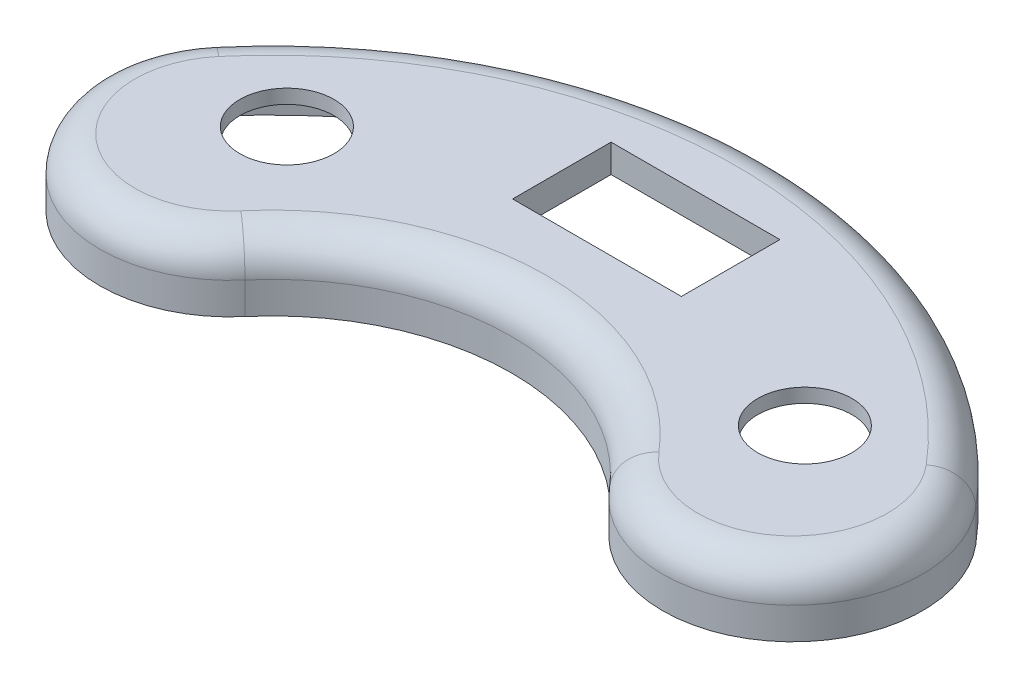
ISO-10303-21;
HEADER;
FILE_DESCRIPTION(('STEP AP214'),'2;1');
FILE_NAME('part.step','',(''),(''),'','','');
FILE_SCHEMA(('AUTOMOTIVE_DESIGN { 1 0 10303 214 1 1 1 1 }'));
ENDSEC;
DATA;
#1=APPLICATION_CONTEXT('core data for automotive mechanical design processes');
#2=APPLICATION_PROTOCOL_DEFINITION('international standard','automotive_design',2000,#1);
#3=PRODUCT_CONTEXT('',#1,'mechanical');
#4=PRODUCT('Part','Part','',(#3));
#5=PRODUCT_RELATED_PRODUCT_CATEGORY('part','',(#4));
#6=PRODUCT_DEFINITION_FORMATION('','',#4);
#7=PRODUCT_DEFINITION_CONTEXT('part definition',#1,'design');
#8=PRODUCT_DEFINITION('design','',#6,#7);
#9=PRODUCT_DEFINITION_SHAPE('','',#8);
#10=(LENGTH_UNIT() NAMED_UNIT(*) SI_UNIT(.MILLI.,.METRE.));
#11=(NAMED_UNIT(*) PLANE_ANGLE_UNIT() SI_UNIT($,.RADIAN.));
#12=(NAMED_UNIT(*) SI_UNIT($,.STERADIAN.) SOLID_ANGLE_UNIT());
#13=UNCERTAINTY_MEASURE_WITH_UNIT(LENGTH_MEASURE(1.E-05),#10,'distance_accuracy_value','');
#14=(GEOMETRIC_REPRESENTATION_CONTEXT(3) GLOBAL_UNCERTAINTY_ASSIGNED_CONTEXT((#13)) GLOBAL_UNIT_ASSIGNED_CONTEXT((#10,
#11,#12)) REPRESENTATION_CONTEXT('',''));
#15=CARTESIAN_POINT('',(0.,0.,0.));
#16=DIRECTION('',(0.,0.,1.));
#17=DIRECTION('',(1.,0.,0.));
#18=AXIS2_PLACEMENT_3D('',#15,#16,#17);
#19=CARTESIAN_POINT('',(32.5063719659927,21.59,21.5139508650748));
#20=DIRECTION('',(0.,1.,0.));
#21=DIRECTION('',(0.,0.,1.));
#22=AXIS2_PLACEMENT_3D('',#19,#20,#21);
#23=PLANE('',#22);
#24=CARTESIAN_POINT('',(53.8552329844878,21.59,-6.26058606286144));
#25=DIRECTION('',(0.,1.,0.));
#26=DIRECTION('',(0.,0.,1.));
#27=AXIS2_PLACEMENT_3D('',#24,#25,#26);
#28=CIRCLE('',#27,8.50000000000001);
#29=CARTESIAN_POINT('',(53.8552329844878,21.59,2.23941393713857));
#30=VERTEX_POINT('',#29);
#31=EDGE_CURVE('E211',#30,#30,#28,.T.);
#32=ORIENTED_EDGE('',*,*,#31,.F.);
#33=EDGE_LOOP('',(#32));
#34=FACE_BOUND('',#33,.T.);
#35=CARTESIAN_POINT('',(-39.6424890525023,21.59,-6.26058606286144));
#36=DIRECTION('',(0.,1.,0.));
#37=DIRECTION('',(0.,0.,1.));
#38=AXIS2_PLACEMENT_3D('',#35,#36,#37);
#39=CIRCLE('',#38,8.5);
#40=CARTESIAN_POINT('',(-39.6424890525023,21.59,2.23941393713856));
#41=VERTEX_POINT('',#40);
#42=EDGE_CURVE('E215',#41,#41,#39,.T.);
#43=ORIENTED_EDGE('',*,*,#42,.F.);
#44=EDGE_LOOP('',(#43));
#45=FACE_BOUND('',#44,.T.);
#46=CARTESIAN_POINT('',(-43.6936280340073,21.59,0.));
#47=DIRECTION('',(0.,1.,0.));
#48=DIRECTION('',(0.,0.,1.));
#49=AXIS2_PLACEMENT_3D('',#46,#47,#48);
#50=CIRCLE('',#49,17.119295081542);
#51=CARTESIAN_POINT('',(-56.7567727604326,21.59,-11.0645611727431));
#52=VERTEX_POINT('',#51);
#53=CARTESIAN_POINT('',(-30.630483307582,21.59,11.0645611727431));
#54=VERTEX_POINT('',#53);
#55=EDGE_CURVE('E286',#52,#54,#50,.T.);
#56=ORIENTED_EDGE('',*,*,#55,.T.);
#57=CARTESIAN_POINT('',(7.10637196599272,21.59,43.0279017301496));
#58=DIRECTION('',(0.,1.,0.));
#59=DIRECTION('',(0.,0.,1.));
#60=AXIS2_PLACEMENT_3D('',#57,#58,#59);
#61=CIRCLE('',#60,49.4542757052155);
#62=CARTESIAN_POINT('',(44.8432272395674,21.59,11.0645611727431));
#63=VERTEX_POINT('',#62);
#64=EDGE_CURVE('E288',#54,#63,#61,.F.);
#65=ORIENTED_EDGE('',*,*,#64,.T.);
#66=CARTESIAN_POINT('',(57.9063719659927,21.59,0.));
#67=DIRECTION('',(0.,1.,0.));
#68=DIRECTION('',(0.,0.,1.));
#69=AXIS2_PLACEMENT_3D('',#66,#67,#68);
#70=CIRCLE('',#69,17.119295081542);
#71=CARTESIAN_POINT('',(70.969516692418,21.59,-11.0645611727431));
#72=VERTEX_POINT('',#71);
#73=EDGE_CURVE('E293',#63,#72,#70,.T.);
#74=ORIENTED_EDGE('',*,*,#73,.T.);
#75=CARTESIAN_POINT('',(7.10637196599272,21.59,43.0279017301496));
#76=DIRECTION('',(0.,1.,0.));
#77=DIRECTION('',(0.,0.,1.));
#78=AXIS2_PLACEMENT_3D('',#75,#76,#77);
#79=CIRCLE('',#78,83.6928658682994);
#80=EDGE_CURVE('E289',#72,#52,#79,.T.);
#81=ORIENTED_EDGE('',*,*,#80,.T.);
#82=EDGE_LOOP('',(#56,#65,#74,#81));
#83=FACE_BOUND('',#82,.T.);
#84=DIRECTION('',(0.,0.,1.));
#85=VECTOR('',#84,1.);
#86=CARTESIAN_POINT('',(-7.95035958705516,21.59,21.5139508650748));
#87=LINE('',#86,#85);
#88=CARTESIAN_POINT('',(-7.95035958705517,21.59,-33.0865472509014));
#89=VERTEX_POINT('',#88);
#90=CARTESIAN_POINT('',(-7.95035958705517,21.59,-15.3065472509014));
#91=VERTEX_POINT('',#90);
#92=EDGE_CURVE('E297',#89,#91,#87,.T.);
#93=ORIENTED_EDGE('',*,*,#92,.F.);
#94=DIRECTION('',(1.,0.,0.));
#95=VECTOR('',#94,1.);
#96=CARTESIAN_POINT('',(32.5063719659927,21.59,-33.0865472509014));
#97=LINE('',#96,#95);
#98=CARTESIAN_POINT('',(22.5296404129448,21.59,-33.0865472509014));
#99=VERTEX_POINT('',#98);
#100=EDGE_CURVE('E277',#89,#99,#97,.T.);
#101=ORIENTED_EDGE('',*,*,#100,.T.);
#102=DIRECTION('',(0.,0.,1.));
#103=VECTOR('',#102,1.);
#104=CARTESIAN_POINT('',(22.5296404129448,21.59,21.5139508650748));
#105=LINE('',#104,#103);
#106=CARTESIAN_POINT('',(22.5296404129448,21.59,-15.3065472509014));
#107=VERTEX_POINT('',#106);
#108=EDGE_CURVE('E304',#99,#107,#105,.T.);
#109=ORIENTED_EDGE('',*,*,#108,.T.);
#110=DIRECTION('',(1.,0.,0.));
#111=VECTOR('',#110,1.);
#112=CARTESIAN_POINT('',(32.5063719659927,21.59,-15.3065472509014));
#113=LINE('',#112,#111);
#114=EDGE_CURVE('E301',#91,#107,#113,.T.);
#115=ORIENTED_EDGE('',*,*,#114,.F.);
#116=EDGE_LOOP('',(#93,#101,#109,#115));
#117=FACE_BOUND('',#116,.T.);
#118=ADVANCED_FACE('F36',(#34,#45,#83,#117),#23,.T.);
#119=CARTESIAN_POINT('',(57.9063719659927,19.05,0.));
#120=DIRECTION('',(0.,-1.,0.));
#121=DIRECTION('',(0.,0.,-1.));
#122=AXIS2_PLACEMENT_3D('',#119,#120,#121);
#123=CYLINDRICAL_SURFACE('',#122,23.469295081542);
#124=DIRECTION('',(0.,-1.,0.));
#125=VECTOR('',#124,1.);
#126=CARTESIAN_POINT('',(39.9977608452041,19.05,15.168699988755));
#127=LINE('',#126,#125);
#128=CARTESIAN_POINT('',(39.9977608452041,15.24,15.168699988755));
#129=VERTEX_POINT('',#128);
#130=CARTESIAN_POINT('',(39.9977608452041,9.525,15.168699988755));
#131=VERTEX_POINT('',#130);
#132=EDGE_CURVE('E319',#129,#131,#127,.T.);
#133=ORIENTED_EDGE('',*,*,#132,.T.);
#134=CARTESIAN_POINT('',(57.9063719659927,9.525,0.));
#135=DIRECTION('',(0.,1.,0.));
#136=DIRECTION('',(0.,0.,1.));
#137=AXIS2_PLACEMENT_3D('',#134,#135,#136);
#138=CIRCLE('',#137,23.469295081542);
#139=CARTESIAN_POINT('',(75.8149830867813,9.525,-15.168699988755));
#140=VERTEX_POINT('',#139);
#141=EDGE_CURVE('E51',#131,#140,#138,.T.);
#142=ORIENTED_EDGE('',*,*,#141,.T.);
#143=DIRECTION('',(0.,-1.,0.));
#144=VECTOR('',#143,1.);
#145=CARTESIAN_POINT('',(75.8149830867813,19.05,-15.168699988755));
#146=LINE('',#145,#144);
#147=CARTESIAN_POINT('',(75.8149830867813,15.24,-15.168699988755));
#148=VERTEX_POINT('',#147);
#149=EDGE_CURVE('E295',#148,#140,#146,.T.);
#150=ORIENTED_EDGE('',*,*,#149,.F.);
#151=CARTESIAN_POINT('',(57.9063719659927,15.24,0.));
#152=DIRECTION('',(0.,-1.,0.));
#153=DIRECTION('',(0.,0.,-1.));
#154=AXIS2_PLACEMENT_3D('',#151,#152,#153);
#155=CIRCLE('',#154,23.469295081542);
#156=EDGE_CURVE('E44',#148,#129,#155,.T.);
#157=ORIENTED_EDGE('',*,*,#156,.T.);
#158=EDGE_LOOP('',(#133,#142,#150,#157));
#159=FACE_BOUND('',#158,.T.);
#160=ADVANCED_FACE('F382',(#159),#123,.T.);
#161=CARTESIAN_POINT('',(7.10637196599272,19.05,43.0279017301496));
#162=DIRECTION('',(0.,-1.,0.));
#163=DIRECTION('',(0.,0.,-1.));
#164=AXIS2_PLACEMENT_3D('',#161,#162,#163);
#165=CYLINDRICAL_SURFACE('',#164,90.0428658682994);
#166=ORIENTED_EDGE('',*,*,#149,.T.);
#167=CARTESIAN_POINT('',(7.10637196599272,9.525,43.0279017301496));
#168=DIRECTION('',(0.,1.,0.));
#169=DIRECTION('',(0.,0.,1.));
#170=AXIS2_PLACEMENT_3D('',#167,#168,#169);
#171=CIRCLE('',#170,90.0428658682994);
#172=CARTESIAN_POINT('',(-61.6022391547959,9.525,-15.168699988755));
#173=VERTEX_POINT('',#172);
#174=EDGE_CURVE('E207',#140,#173,#171,.T.);
#175=ORIENTED_EDGE('',*,*,#174,.T.);
#176=DIRECTION('',(0.,-1.,0.));
#177=VECTOR('',#176,1.);
#178=CARTESIAN_POINT('',(-61.6022391547959,19.05,-15.168699988755));
#179=LINE('',#178,#177);
#180=CARTESIAN_POINT('',(-61.6022391547959,15.24,-15.168699988755));
#181=VERTEX_POINT('',#180);
#182=EDGE_CURVE('E325',#181,#173,#179,.T.);
#183=ORIENTED_EDGE('',*,*,#182,.F.);
#184=CARTESIAN_POINT('',(7.10637196599272,15.24,43.0279017301496));
#185=DIRECTION('',(0.,-1.,0.));
#186=DIRECTION('',(0.,0.,-1.));
#187=AXIS2_PLACEMENT_3D('',#184,#185,#186);
#188=CIRCLE('',#187,90.0428658682994);
#189=EDGE_CURVE('E314',#181,#148,#188,.T.);
#190=ORIENTED_EDGE('',*,*,#189,.T.);
#191=EDGE_LOOP('',(#166,#175,#183,#190));
#192=FACE_BOUND('',#191,.T.);
#193=ADVANCED_FACE('F388',(#192),#165,.T.);
#194=CARTESIAN_POINT('',(-43.6936280340073,19.05,0.));
#195=DIRECTION('',(0.,-1.,0.));
#196=DIRECTION('',(0.,0.,-1.));
#197=AXIS2_PLACEMENT_3D('',#194,#195,#196);
#198=CYLINDRICAL_SURFACE('',#197,23.469295081542);
#199=ORIENTED_EDGE('',*,*,#182,.T.);
#200=CARTESIAN_POINT('',(-43.6936280340073,9.525,0.));
#201=DIRECTION('',(0.,1.,0.));
#202=DIRECTION('',(0.,0.,1.));
#203=AXIS2_PLACEMENT_3D('',#200,#201,#202);
#204=CIRCLE('',#203,23.469295081542);
#205=CARTESIAN_POINT('',(-25.7850169132187,9.525,15.168699988755));
#206=VERTEX_POINT('',#205);
#207=EDGE_CURVE('E204',#173,#206,#204,.T.);
#208=ORIENTED_EDGE('',*,*,#207,.T.);
#209=DIRECTION('',(0.,-1.,0.));
#210=VECTOR('',#209,1.);
#211=CARTESIAN_POINT('',(-25.7850169132187,19.05,15.168699988755));
#212=LINE('',#211,#210);
#213=CARTESIAN_POINT('',(-25.7850169132187,15.24,15.168699988755));
#214=VERTEX_POINT('',#213);
#215=EDGE_CURVE('E322',#214,#206,#212,.T.);
#216=ORIENTED_EDGE('',*,*,#215,.F.);
#217=CARTESIAN_POINT('',(-43.6936280340073,15.24,0.));
#218=DIRECTION('',(0.,-1.,0.));
#219=DIRECTION('',(0.,0.,-1.));
#220=AXIS2_PLACEMENT_3D('',#217,#218,#219);
#221=CIRCLE('',#220,23.469295081542);
#222=EDGE_CURVE('E316',#214,#181,#221,.T.);
#223=ORIENTED_EDGE('',*,*,#222,.T.);
#224=EDGE_LOOP('',(#199,#208,#216,#223));
#225=FACE_BOUND('',#224,.T.);
#226=ADVANCED_FACE('F399',(#225),#198,.T.);
#227=CARTESIAN_POINT('',(7.10637196599272,19.05,43.0279017301496));
#228=DIRECTION('',(0.,-1.,0.));
#229=DIRECTION('',(0.,0.,-1.));
#230=AXIS2_PLACEMENT_3D('',#227,#228,#229);
#231=CYLINDRICAL_SURFACE('',#230,43.1042757052155);
#232=ORIENTED_EDGE('',*,*,#215,.T.);
#233=CARTESIAN_POINT('',(7.10637196599272,9.525,43.0279017301496));
#234=DIRECTION('',(0.,1.,0.));
#235=DIRECTION('',(0.,0.,1.));
#236=AXIS2_PLACEMENT_3D('',#233,#234,#235);
#237=CIRCLE('',#236,43.1042757052155);
#238=EDGE_CURVE('E193',#206,#131,#237,.F.);
#239=ORIENTED_EDGE('',*,*,#238,.T.);
#240=ORIENTED_EDGE('',*,*,#132,.F.);
#241=CARTESIAN_POINT('',(7.10637196599272,15.24,43.0279017301496));
#242=DIRECTION('',(0.,-1.,0.));
#243=DIRECTION('',(0.,0.,-1.));
#244=AXIS2_PLACEMENT_3D('',#241,#242,#243);
#245=CIRCLE('',#244,43.1042757052155);
#246=EDGE_CURVE('E292',#129,#214,#245,.F.);
#247=ORIENTED_EDGE('',*,*,#246,.T.);
#248=EDGE_LOOP('',(#232,#239,#240,#247));
#249=FACE_BOUND('',#248,.T.);
#250=ADVANCED_FACE('F403',(#249),#231,.F.);
#251=CARTESIAN_POINT('',(7.10637196599272,15.24,43.0279017301496));
#252=DIRECTION('',(0.,1.,0.));
#253=DIRECTION('',(0.,0.,1.));
#254=AXIS2_PLACEMENT_3D('',#251,#252,#253);
#255=TOROIDAL_SURFACE('',#254,83.6928658682994,6.35);
#256=CARTESIAN_POINT('',(70.969516692418,15.24,-11.0645611727431));
#257=DIRECTION('',(0.646321073387707,0.,0.763065573915481));
#258=DIRECTION('',(0.763065573915481,0.,-0.646321073387707));
#259=AXIS2_PLACEMENT_3D('',#256,#257,#258);
#260=CIRCLE('',#259,6.35);
#261=EDGE_CURVE('E309',#148,#72,#260,.T.);
#262=ORIENTED_EDGE('',*,*,#261,.F.);
#263=ORIENTED_EDGE('',*,*,#189,.F.);
#264=CARTESIAN_POINT('',(-56.7567727604326,15.24,-11.0645611727431));
#265=DIRECTION('',(0.646321073387707,0.,-0.763065573915481));
#266=DIRECTION('',(-0.763065573915481,0.,-0.646321073387707));
#267=AXIS2_PLACEMENT_3D('',#264,#265,#266);
#268=CIRCLE('',#267,6.35);
#269=EDGE_CURVE('E312',#52,#181,#268,.F.);
#270=ORIENTED_EDGE('',*,*,#269,.F.);
#271=ORIENTED_EDGE('',*,*,#80,.F.);
#272=EDGE_LOOP('',(#262,#263,#270,#271));
#273=FACE_BOUND('',#272,.T.);
#274=ADVANCED_FACE('F407',(#273),#255,.T.);
#275=CARTESIAN_POINT('',(-43.6936280340073,15.24,0.));
#276=DIRECTION('',(0.,1.,0.));
#277=DIRECTION('',(0.,0.,1.));
#278=AXIS2_PLACEMENT_3D('',#275,#276,#277);
#279=TOROIDAL_SURFACE('',#278,17.119295081542,6.35);
#280=ORIENTED_EDGE('',*,*,#269,.T.);
#281=ORIENTED_EDGE('',*,*,#222,.F.);
#282=CARTESIAN_POINT('',(-30.630483307582,15.24,11.0645611727431));
#283=DIRECTION('',(0.646321073387707,0.,-0.763065573915481));
#284=DIRECTION('',(-0.763065573915481,0.,-0.646321073387707));
#285=AXIS2_PLACEMENT_3D('',#282,#283,#284);
#286=CIRCLE('',#285,6.35);
#287=EDGE_CURVE('E313',#54,#214,#286,.T.);
#288=ORIENTED_EDGE('',*,*,#287,.F.);
#289=ORIENTED_EDGE('',*,*,#55,.F.);
#290=EDGE_LOOP('',(#280,#281,#288,#289));
#291=FACE_BOUND('',#290,.T.);
#292=ADVANCED_FACE('F411',(#291),#279,.T.);
#293=CARTESIAN_POINT('',(57.9063719659927,15.24,0.));
#294=DIRECTION('',(0.,1.,0.));
#295=DIRECTION('',(0.,0.,1.));
#296=AXIS2_PLACEMENT_3D('',#293,#294,#295);
#297=TOROIDAL_SURFACE('',#296,17.119295081542,6.35);
#298=ORIENTED_EDGE('',*,*,#261,.T.);
#299=ORIENTED_EDGE('',*,*,#73,.F.);
#300=CARTESIAN_POINT('',(44.8432272395674,15.24,11.0645611727431));
#301=DIRECTION('',(0.646321073387707,0.,0.763065573915481));
#302=DIRECTION('',(0.763065573915481,0.,-0.646321073387707));
#303=AXIS2_PLACEMENT_3D('',#300,#301,#302);
#304=CIRCLE('',#303,6.35);
#305=EDGE_CURVE('E335',#129,#63,#304,.F.);
#306=ORIENTED_EDGE('',*,*,#305,.F.);
#307=ORIENTED_EDGE('',*,*,#156,.F.);
#308=EDGE_LOOP('',(#298,#299,#306,#307));
#309=FACE_BOUND('',#308,.T.);
#310=ADVANCED_FACE('F415',(#309),#297,.T.);
#311=CARTESIAN_POINT('',(7.10637196599272,15.24,43.0279017301496));
#312=DIRECTION('',(0.,1.,0.));
#313=DIRECTION('',(0.,0.,1.));
#314=AXIS2_PLACEMENT_3D('',#311,#312,#313);
#315=TOROIDAL_SURFACE('',#314,49.4542757052155,6.35);
#316=ORIENTED_EDGE('',*,*,#287,.T.);
#317=ORIENTED_EDGE('',*,*,#246,.F.);
#318=ORIENTED_EDGE('',*,*,#305,.T.);
#319=ORIENTED_EDGE('',*,*,#64,.F.);
#320=EDGE_LOOP('',(#316,#317,#318,#319));
#321=FACE_BOUND('',#320,.T.);
#322=ADVANCED_FACE('F419',(#321),#315,.T.);
#323=CARTESIAN_POINT('',(-10.4903595870552,16.51,-33.0865472509014));
#324=DIRECTION('',(0.,0.,1.));
#325=DIRECTION('',(1.,0.,0.));
#326=AXIS2_PLACEMENT_3D('',#323,#324,#325);
#327=PLANE('',#326);
#328=ORIENTED_EDGE('',*,*,#100,.F.);
#329=DIRECTION('',(0.,1.,0.));
#330=VECTOR('',#329,1.);
#331=CARTESIAN_POINT('',(-7.95035958705517,16.51,-33.0865472509014));
#332=LINE('',#331,#330);
#333=CARTESIAN_POINT('',(-7.95035958705517,16.51,-33.0865472509014));
#334=VERTEX_POINT('',#333);
#335=EDGE_CURVE('E338',#334,#89,#332,.T.);
#336=ORIENTED_EDGE('',*,*,#335,.F.);
#337=DIRECTION('',(1.,0.,0.));
#338=VECTOR('',#337,1.);
#339=CARTESIAN_POINT('',(-10.4903595870552,16.51,-33.0865472509014));
#340=LINE('',#339,#338);
#341=CARTESIAN_POINT('',(22.5296404129448,16.51,-33.0865472509014));
#342=VERTEX_POINT('',#341);
#343=EDGE_CURVE('E300',#334,#342,#340,.T.);
#344=ORIENTED_EDGE('',*,*,#343,.T.);
#345=DIRECTION('',(0.,1.,0.));
#346=VECTOR('',#345,1.);
#347=CARTESIAN_POINT('',(22.5296404129448,16.51,-33.0865472509014));
#348=LINE('',#347,#346);
#349=EDGE_CURVE('E337',#342,#99,#348,.T.);
#350=ORIENTED_EDGE('',*,*,#349,.T.);
#351=EDGE_LOOP('',(#328,#336,#344,#350));
#352=FACE_BOUND('',#351,.T.);
#353=ADVANCED_FACE('F367',(#352),#327,.T.);
#354=CARTESIAN_POINT('',(22.5296404129448,16.51,-35.6265472509014));
#355=DIRECTION('',(-1.,0.,0.));
#356=DIRECTION('',(0.,0.,1.));
#357=AXIS2_PLACEMENT_3D('',#354,#355,#356);
#358=PLANE('',#357);
#359=ORIENTED_EDGE('',*,*,#108,.F.);
#360=ORIENTED_EDGE('',*,*,#349,.F.);
#361=DIRECTION('',(0.,0.,1.));
#362=VECTOR('',#361,1.);
#363=CARTESIAN_POINT('',(22.5296404129448,16.51,-35.6265472509014));
#364=LINE('',#363,#362);
#365=CARTESIAN_POINT('',(22.5296404129448,16.51,-15.3065472509014));
#366=VERTEX_POINT('',#365);
#367=EDGE_CURVE('E350',#342,#366,#364,.T.);
#368=ORIENTED_EDGE('',*,*,#367,.T.);
#369=DIRECTION('',(0.,1.,0.));
#370=VECTOR('',#369,1.);
#371=CARTESIAN_POINT('',(22.5296404129448,16.51,-15.3065472509014));
#372=LINE('',#371,#370);
#373=EDGE_CURVE('E345',#366,#107,#372,.T.);
#374=ORIENTED_EDGE('',*,*,#373,.T.);
#375=EDGE_LOOP('',(#359,#360,#368,#374));
#376=FACE_BOUND('',#375,.T.);
#377=ADVANCED_FACE('F357',(#376),#358,.T.);
#378=CARTESIAN_POINT('',(-10.4903595870552,16.51,-15.3065472509014));
#379=DIRECTION('',(0.,0.,1.));
#380=DIRECTION('',(1.,0.,0.));
#381=AXIS2_PLACEMENT_3D('',#378,#379,#380);
#382=PLANE('',#381);
#383=ORIENTED_EDGE('',*,*,#114,.T.);
#384=ORIENTED_EDGE('',*,*,#373,.F.);
#385=DIRECTION('',(1.,0.,0.));
#386=VECTOR('',#385,1.);
#387=CARTESIAN_POINT('',(-10.4903595870552,16.51,-15.3065472509014));
#388=LINE('',#387,#386);
#389=CARTESIAN_POINT('',(-7.95035958705517,16.51,-15.3065472509014));
#390=VERTEX_POINT('',#389);
#391=EDGE_CURVE('E352',#390,#366,#388,.T.);
#392=ORIENTED_EDGE('',*,*,#391,.F.);
#393=DIRECTION('',(0.,1.,0.));
#394=VECTOR('',#393,1.);
#395=CARTESIAN_POINT('',(-7.95035958705517,16.51,-15.3065472509014));
#396=LINE('',#395,#394);
#397=EDGE_CURVE('E341',#390,#91,#396,.T.);
#398=ORIENTED_EDGE('',*,*,#397,.T.);
#399=EDGE_LOOP('',(#383,#384,#392,#398));
#400=FACE_BOUND('',#399,.T.);
#401=ADVANCED_FACE('F361',(#400),#382,.F.);
#402=CARTESIAN_POINT('',(-7.95035958705517,16.51,-35.6265472509014));
#403=DIRECTION('',(-1.,0.,0.));
#404=DIRECTION('',(0.,0.,1.));
#405=AXIS2_PLACEMENT_3D('',#402,#403,#404);
#406=PLANE('',#405);
#407=ORIENTED_EDGE('',*,*,#92,.T.);
#408=ORIENTED_EDGE('',*,*,#397,.F.);
#409=DIRECTION('',(0.,0.,1.));
#410=VECTOR('',#409,1.);
#411=CARTESIAN_POINT('',(-7.95035958705517,16.51,-35.6265472509014));
#412=LINE('',#411,#410);
#413=EDGE_CURVE('E342',#334,#390,#412,.T.);
#414=ORIENTED_EDGE('',*,*,#413,.F.);
#415=ORIENTED_EDGE('',*,*,#335,.T.);
#416=EDGE_LOOP('',(#407,#408,#414,#415));
#417=FACE_BOUND('',#416,.T.);
#418=ADVANCED_FACE('F38',(#417),#406,.F.);
#419=CARTESIAN_POINT('',(32.5063719659927,19.05,21.5139508650748));
#420=DIRECTION('',(0.,1.,0.));
#421=DIRECTION('',(0.,0.,1.));
#422=AXIS2_PLACEMENT_3D('',#419,#420,#421);
#423=PLANE('',#422);
#424=CARTESIAN_POINT('',(53.8552329844878,19.05,-6.26058606286144));
#425=DIRECTION('',(0.,1.,0.));
#426=DIRECTION('',(0.,0.,1.));
#427=AXIS2_PLACEMENT_3D('',#424,#425,#426);
#428=CIRCLE('',#427,8.50000000000001);
#429=CARTESIAN_POINT('',(53.8552329844878,19.05,2.23941393713857));
#430=VERTEX_POINT('',#429);
#431=EDGE_CURVE('E212',#430,#430,#428,.T.);
#432=ORIENTED_EDGE('',*,*,#431,.T.);
#433=EDGE_LOOP('',(#432));
#434=FACE_BOUND('',#433,.T.);
#435=CARTESIAN_POINT('',(-39.6424890525023,19.05,-6.26058606286144));
#436=DIRECTION('',(0.,1.,0.));
#437=DIRECTION('',(0.,0.,1.));
#438=AXIS2_PLACEMENT_3D('',#435,#436,#437);
#439=CIRCLE('',#438,8.5);
#440=CARTESIAN_POINT('',(-39.6424890525023,19.05,2.23941393713856));
#441=VERTEX_POINT('',#440);
#442=EDGE_CURVE('E218',#441,#441,#439,.T.);
#443=ORIENTED_EDGE('',*,*,#442,.T.);
#444=EDGE_LOOP('',(#443));
#445=FACE_BOUND('',#444,.T.);
#446=CARTESIAN_POINT('',(-43.6936280340073,19.05,0.));
#447=DIRECTION('',(0.,1.,0.));
#448=DIRECTION('',(0.,0.,1.));
#449=AXIS2_PLACEMENT_3D('',#446,#447,#448);
#450=CIRCLE('',#449,17.119295081542);
#451=CARTESIAN_POINT('',(-56.7567727604326,19.05,-11.0645611727431));
#452=VERTEX_POINT('',#451);
#453=CARTESIAN_POINT('',(-30.630483307582,19.05,11.0645611727431));
#454=VERTEX_POINT('',#453);
#455=EDGE_CURVE('E265',#452,#454,#450,.T.);
#456=ORIENTED_EDGE('',*,*,#455,.F.);
#457=CARTESIAN_POINT('',(7.10637196599272,19.05,43.0279017301496));
#458=DIRECTION('',(0.,1.,0.));
#459=DIRECTION('',(0.,0.,1.));
#460=AXIS2_PLACEMENT_3D('',#457,#458,#459);
#461=CIRCLE('',#460,83.6928658682994);
#462=CARTESIAN_POINT('',(70.969516692418,19.05,-11.0645611727431));
#463=VERTEX_POINT('',#462);
#464=EDGE_CURVE('E263',#463,#452,#461,.T.);
#465=ORIENTED_EDGE('',*,*,#464,.F.);
#466=CARTESIAN_POINT('',(57.9063719659927,19.05,0.));
#467=DIRECTION('',(0.,1.,0.));
#468=DIRECTION('',(0.,0.,1.));
#469=AXIS2_PLACEMENT_3D('',#466,#467,#468);
#470=CIRCLE('',#469,17.119295081542);
#471=CARTESIAN_POINT('',(44.8432272395674,19.05,11.0645611727431));
#472=VERTEX_POINT('',#471);
#473=EDGE_CURVE('E261',#472,#463,#470,.T.);
#474=ORIENTED_EDGE('',*,*,#473,.F.);
#475=CARTESIAN_POINT('',(7.10637196599272,19.05,43.0279017301496));
#476=DIRECTION('',(0.,1.,0.));
#477=DIRECTION('',(0.,0.,1.));
#478=AXIS2_PLACEMENT_3D('',#475,#476,#477);
#479=CIRCLE('',#478,49.4542757052155);
#480=EDGE_CURVE('E267',#454,#472,#479,.F.);
#481=ORIENTED_EDGE('',*,*,#480,.F.);
#482=EDGE_LOOP('',(#456,#465,#474,#481));
#483=FACE_BOUND('',#482,.T.);
#484=DIRECTION('',(0.,0.,1.));
#485=VECTOR('',#484,1.);
#486=CARTESIAN_POINT('',(-10.4903595870552,19.05,-35.6265472509014));
#487=LINE('',#486,#485);
#488=CARTESIAN_POINT('',(-10.4903595870552,19.05,-35.6265472509014));
#489=VERTEX_POINT('',#488);
#490=CARTESIAN_POINT('',(-10.4903595870552,19.05,-12.7665472509014));
#491=VERTEX_POINT('',#490);
#492=EDGE_CURVE('E228',#489,#491,#487,.T.);
#493=ORIENTED_EDGE('',*,*,#492,.T.);
#494=DIRECTION('',(1.,0.,0.));
#495=VECTOR('',#494,1.);
#496=CARTESIAN_POINT('',(-10.4903595870552,19.05,-12.7665472509014));
#497=LINE('',#496,#495);
#498=CARTESIAN_POINT('',(25.0696404129448,19.05,-12.7665472509014));
#499=VERTEX_POINT('',#498);
#500=EDGE_CURVE('E242',#491,#499,#497,.T.);
#501=ORIENTED_EDGE('',*,*,#500,.T.);
#502=DIRECTION('',(0.,0.,1.));
#503=VECTOR('',#502,1.);
#504=CARTESIAN_POINT('',(25.0696404129448,19.05,-35.6265472509014));
#505=LINE('',#504,#503);
#506=CARTESIAN_POINT('',(25.0696404129448,19.05,-35.6265472509014));
#507=VERTEX_POINT('',#506);
#508=EDGE_CURVE('E239',#507,#499,#505,.T.);
#509=ORIENTED_EDGE('',*,*,#508,.F.);
#510=DIRECTION('',(1.,0.,0.));
#511=VECTOR('',#510,1.);
#512=CARTESIAN_POINT('',(-10.4903595870552,19.05,-35.6265472509014));
#513=LINE('',#512,#511);
#514=EDGE_CURVE('E221',#489,#507,#513,.T.);
#515=ORIENTED_EDGE('',*,*,#514,.F.);
#516=EDGE_LOOP('',(#493,#501,#509,#515));
#517=FACE_BOUND('',#516,.T.);
#518=ADVANCED_FACE('F374',(#434,#445,#483,#517),#423,.F.);
#519=CARTESIAN_POINT('',(57.9063719659927,19.05,0.));
#520=DIRECTION('',(0.,-1.,0.));
#521=DIRECTION('',(0.,0.,-1.));
#522=AXIS2_PLACEMENT_3D('',#519,#520,#521);
#523=CYLINDRICAL_SURFACE('',#522,20.929295081542);
#524=CARTESIAN_POINT('',(57.9063719659927,9.525,0.));
#525=DIRECTION('',(0.,1.,0.));
#526=DIRECTION('',(0.,0.,1.));
#527=AXIS2_PLACEMENT_3D('',#524,#525,#526);
#528=CIRCLE('',#527,20.929295081542);
#529=CARTESIAN_POINT('',(41.9359474029494,9.525,13.5270444623503));
#530=VERTEX_POINT('',#529);
#531=CARTESIAN_POINT('',(73.876796529036,9.525,-13.5270444623503));
#532=VERTEX_POINT('',#531);
#533=EDGE_CURVE('E189',#530,#532,#528,.T.);
#534=ORIENTED_EDGE('',*,*,#533,.F.);
#535=DIRECTION('',(0.,-1.,0.));
#536=VECTOR('',#535,1.);
#537=CARTESIAN_POINT('',(41.9359474029494,19.05,13.5270444623503));
#538=LINE('',#537,#536);
#539=CARTESIAN_POINT('',(41.9359474029494,15.24,13.5270444623503));
#540=VERTEX_POINT('',#539);
#541=EDGE_CURVE('E175',#540,#530,#538,.T.);
#542=ORIENTED_EDGE('',*,*,#541,.F.);
#543=CARTESIAN_POINT('',(57.9063719659927,15.24,0.));
#544=DIRECTION('',(0.,1.,0.));
#545=DIRECTION('',(0.,0.,1.));
#546=AXIS2_PLACEMENT_3D('',#543,#544,#545);
#547=CIRCLE('',#546,20.929295081542);
#548=CARTESIAN_POINT('',(73.876796529036,15.24,-13.5270444623503));
#549=VERTEX_POINT('',#548);
#550=EDGE_CURVE('E275',#549,#540,#547,.F.);
#551=ORIENTED_EDGE('',*,*,#550,.F.);
#552=DIRECTION('',(0.,-1.,0.));
#553=VECTOR('',#552,1.);
#554=CARTESIAN_POINT('',(73.876796529036,19.05,-13.5270444623503));
#555=LINE('',#554,#553);
#556=EDGE_CURVE('E191',#549,#532,#555,.T.);
#557=ORIENTED_EDGE('',*,*,#556,.T.);
#558=EDGE_LOOP('',(#534,#542,#551,#557));
#559=FACE_BOUND('',#558,.T.);
#560=ADVANCED_FACE('F190',(#559),#523,.F.);
#561=CARTESIAN_POINT('',(7.10637196599272,19.05,43.0279017301496));
#562=DIRECTION('',(0.,-1.,0.));
#563=DIRECTION('',(0.,0.,-1.));
#564=AXIS2_PLACEMENT_3D('',#561,#562,#563);
#565=CYLINDRICAL_SURFACE('',#564,87.5028658682994);
#566=CARTESIAN_POINT('',(7.10637196599272,9.525,43.0279017301496));
#567=DIRECTION('',(0.,1.,0.));
#568=DIRECTION('',(0.,0.,1.));
#569=AXIS2_PLACEMENT_3D('',#566,#567,#568);
#570=CIRCLE('',#569,87.5028658682994);
#571=CARTESIAN_POINT('',(-59.6640525970506,9.525,-13.5270444623502));
#572=VERTEX_POINT('',#571);
#573=EDGE_CURVE('E59',#532,#572,#570,.T.);
#574=ORIENTED_EDGE('',*,*,#573,.F.);
#575=ORIENTED_EDGE('',*,*,#556,.F.);
#576=CARTESIAN_POINT('',(7.10637196599272,15.24,43.0279017301496));
#577=DIRECTION('',(0.,1.,0.));
#578=DIRECTION('',(0.,0.,1.));
#579=AXIS2_PLACEMENT_3D('',#576,#577,#578);
#580=CIRCLE('',#579,87.5028658682994);
#581=CARTESIAN_POINT('',(-59.6640525970506,15.24,-13.5270444623502));
#582=VERTEX_POINT('',#581);
#583=EDGE_CURVE('E273',#582,#549,#580,.F.);
#584=ORIENTED_EDGE('',*,*,#583,.F.);
#585=DIRECTION('',(0.,-1.,0.));
#586=VECTOR('',#585,1.);
#587=CARTESIAN_POINT('',(-59.6640525970506,19.05,-13.5270444623502));
#588=LINE('',#587,#586);
#589=EDGE_CURVE('E258',#582,#572,#588,.T.);
#590=ORIENTED_EDGE('',*,*,#589,.T.);
#591=EDGE_LOOP('',(#574,#575,#584,#590));
#592=FACE_BOUND('',#591,.T.);
#593=ADVANCED_FACE('F592',(#592),#565,.F.);
#594=CARTESIAN_POINT('',(-43.6936280340073,19.05,0.));
#595=DIRECTION('',(0.,-1.,0.));
#596=DIRECTION('',(0.,0.,-1.));
#597=AXIS2_PLACEMENT_3D('',#594,#595,#596);
#598=CYLINDRICAL_SURFACE('',#597,20.929295081542);
#599=CARTESIAN_POINT('',(-43.6936280340073,9.525,0.));
#600=DIRECTION('',(0.,1.,0.));
#601=DIRECTION('',(0.,0.,1.));
#602=AXIS2_PLACEMENT_3D('',#599,#600,#601);
#603=CIRCLE('',#602,20.929295081542);
#604=CARTESIAN_POINT('',(-27.723203470964,9.525,13.5270444623503));
#605=VERTEX_POINT('',#604);
#606=EDGE_CURVE('E197',#572,#605,#603,.T.);
#607=ORIENTED_EDGE('',*,*,#606,.F.);
#608=ORIENTED_EDGE('',*,*,#589,.F.);
#609=CARTESIAN_POINT('',(-43.6936280340073,15.24,0.));
#610=DIRECTION('',(0.,1.,0.));
#611=DIRECTION('',(0.,0.,1.));
#612=AXIS2_PLACEMENT_3D('',#609,#610,#611);
#613=CIRCLE('',#612,20.929295081542);
#614=CARTESIAN_POINT('',(-27.723203470964,15.24,13.5270444623503));
#615=VERTEX_POINT('',#614);
#616=EDGE_CURVE('E271',#615,#582,#613,.F.);
#617=ORIENTED_EDGE('',*,*,#616,.F.);
#618=DIRECTION('',(0.,-1.,0.));
#619=VECTOR('',#618,1.);
#620=CARTESIAN_POINT('',(-27.723203470964,19.05,13.5270444623503));
#621=LINE('',#620,#619);
#622=EDGE_CURVE('E185',#615,#605,#621,.T.);
#623=ORIENTED_EDGE('',*,*,#622,.T.);
#624=EDGE_LOOP('',(#607,#608,#617,#623));
#625=FACE_BOUND('',#624,.T.);
#626=ADVANCED_FACE('F601',(#625),#598,.F.);
#627=CARTESIAN_POINT('',(7.10637196599272,19.05,43.0279017301496));
#628=DIRECTION('',(0.,-1.,0.));
#629=DIRECTION('',(0.,0.,-1.));
#630=AXIS2_PLACEMENT_3D('',#627,#628,#629);
#631=CYLINDRICAL_SURFACE('',#630,45.6442757052155);
#632=CARTESIAN_POINT('',(7.10637196599272,9.525,43.0279017301496));
#633=DIRECTION('',(0.,1.,0.));
#634=DIRECTION('',(0.,0.,1.));
#635=AXIS2_PLACEMENT_3D('',#632,#633,#634);
#636=CIRCLE('',#635,45.6442757052155);
#637=EDGE_CURVE('E12',#605,#530,#636,.F.);
#638=ORIENTED_EDGE('',*,*,#637,.F.);
#639=ORIENTED_EDGE('',*,*,#622,.F.);
#640=CARTESIAN_POINT('',(7.10637196599272,15.24,43.0279017301496));
#641=DIRECTION('',(0.,1.,0.));
#642=DIRECTION('',(0.,0.,1.));
#643=AXIS2_PLACEMENT_3D('',#640,#641,#642);
#644=CIRCLE('',#643,45.6442757052155);
#645=EDGE_CURVE('E181',#540,#615,#644,.T.);
#646=ORIENTED_EDGE('',*,*,#645,.F.);
#647=ORIENTED_EDGE('',*,*,#541,.T.);
#648=EDGE_LOOP('',(#638,#639,#646,#647));
#649=FACE_BOUND('',#648,.T.);
#650=ADVANCED_FACE('F177',(#649),#631,.T.);
#651=CARTESIAN_POINT('',(7.10637196599272,15.24,43.0279017301496));
#652=DIRECTION('',(0.,1.,0.));
#653=DIRECTION('',(0.,0.,1.));
#654=AXIS2_PLACEMENT_3D('',#651,#652,#653);
#655=TOROIDAL_SURFACE('',#654,83.6928658682994,3.81);
#656=CARTESIAN_POINT('',(70.969516692418,15.24,-11.0645611727431));
#657=DIRECTION('',(0.646321073387707,0.,0.763065573915481));
#658=DIRECTION('',(0.763065573915481,0.,-0.646321073387707));
#659=AXIS2_PLACEMENT_3D('',#656,#657,#658);
#660=CIRCLE('',#659,3.81);
#661=EDGE_CURVE('E281',#549,#463,#660,.T.);
#662=ORIENTED_EDGE('',*,*,#661,.T.);
#663=ORIENTED_EDGE('',*,*,#464,.T.);
#664=CARTESIAN_POINT('',(-56.7567727604326,15.24,-11.0645611727431));
#665=DIRECTION('',(-0.646321073387707,0.,0.763065573915481));
#666=DIRECTION('',(0.763065573915481,0.,0.646321073387707));
#667=AXIS2_PLACEMENT_3D('',#664,#665,#666);
#668=CIRCLE('',#667,3.81);
#669=EDGE_CURVE('E186',#452,#582,#668,.T.);
#670=ORIENTED_EDGE('',*,*,#669,.T.);
#671=ORIENTED_EDGE('',*,*,#583,.T.);
#672=EDGE_LOOP('',(#662,#663,#670,#671));
#673=FACE_BOUND('',#672,.T.);
#674=ADVANCED_FACE('F394',(#673),#655,.F.);
#675=CARTESIAN_POINT('',(-43.6936280340073,15.24,0.));
#676=DIRECTION('',(0.,1.,0.));
#677=DIRECTION('',(0.,0.,1.));
#678=AXIS2_PLACEMENT_3D('',#675,#676,#677);
#679=TOROIDAL_SURFACE('',#678,17.119295081542,3.81);
#680=ORIENTED_EDGE('',*,*,#669,.F.);
#681=ORIENTED_EDGE('',*,*,#455,.T.);
#682=CARTESIAN_POINT('',(-30.630483307582,15.24,11.0645611727431));
#683=DIRECTION('',(0.646321073387707,0.,-0.763065573915481));
#684=DIRECTION('',(-0.763065573915481,0.,-0.646321073387707));
#685=AXIS2_PLACEMENT_3D('',#682,#683,#684);
#686=CIRCLE('',#685,3.81);
#687=EDGE_CURVE('E279',#454,#615,#686,.T.);
#688=ORIENTED_EDGE('',*,*,#687,.T.);
#689=ORIENTED_EDGE('',*,*,#616,.T.);
#690=EDGE_LOOP('',(#680,#681,#688,#689));
#691=FACE_BOUND('',#690,.T.);
#692=ADVANCED_FACE('F449',(#691),#679,.F.);
#693=CARTESIAN_POINT('',(57.9063719659927,15.24,0.));
#694=DIRECTION('',(0.,1.,0.));
#695=DIRECTION('',(0.,0.,1.));
#696=AXIS2_PLACEMENT_3D('',#693,#694,#695);
#697=TOROIDAL_SURFACE('',#696,17.119295081542,3.81);
#698=ORIENTED_EDGE('',*,*,#661,.F.);
#699=ORIENTED_EDGE('',*,*,#550,.T.);
#700=CARTESIAN_POINT('',(44.8432272395674,15.24,11.0645611727431));
#701=DIRECTION('',(-0.646321073387707,0.,-0.763065573915481));
#702=DIRECTION('',(-0.763065573915481,0.,0.646321073387707));
#703=AXIS2_PLACEMENT_3D('',#700,#701,#702);
#704=CIRCLE('',#703,3.81);
#705=EDGE_CURVE('E255',#540,#472,#704,.T.);
#706=ORIENTED_EDGE('',*,*,#705,.T.);
#707=ORIENTED_EDGE('',*,*,#473,.T.);
#708=EDGE_LOOP('',(#698,#699,#706,#707));
#709=FACE_BOUND('',#708,.T.);
#710=ADVANCED_FACE('F460',(#709),#697,.F.);
#711=CARTESIAN_POINT('',(7.10637196599272,15.24,43.0279017301496));
#712=DIRECTION('',(0.,1.,0.));
#713=DIRECTION('',(0.,0.,1.));
#714=AXIS2_PLACEMENT_3D('',#711,#712,#713);
#715=TOROIDAL_SURFACE('',#714,49.4542757052155,3.81);
#716=ORIENTED_EDGE('',*,*,#687,.F.);
#717=ORIENTED_EDGE('',*,*,#480,.T.);
#718=ORIENTED_EDGE('',*,*,#705,.F.);
#719=ORIENTED_EDGE('',*,*,#645,.T.);
#720=EDGE_LOOP('',(#716,#717,#718,#719));
#721=FACE_BOUND('',#720,.T.);
#722=ADVANCED_FACE('F469',(#721),#715,.F.);
#723=CARTESIAN_POINT('',(-10.4903595870552,16.51,-35.6265472509014));
#724=DIRECTION('',(0.,0.,1.));
#725=DIRECTION('',(1.,0.,0.));
#726=AXIS2_PLACEMENT_3D('',#723,#724,#725);
#727=PLANE('',#726);
#728=ORIENTED_EDGE('',*,*,#514,.T.);
#729=DIRECTION('',(0.,1.,0.));
#730=VECTOR('',#729,1.);
#731=CARTESIAN_POINT('',(25.0696404129448,16.51,-35.6265472509014));
#732=LINE('',#731,#730);
#733=CARTESIAN_POINT('',(25.0696404129448,16.51,-35.6265472509014));
#734=VERTEX_POINT('',#733);
#735=EDGE_CURVE('E253',#734,#507,#732,.T.);
#736=ORIENTED_EDGE('',*,*,#735,.F.);
#737=DIRECTION('',(1.,0.,0.));
#738=VECTOR('',#737,1.);
#739=CARTESIAN_POINT('',(-10.4903595870552,16.51,-35.6265472509014));
#740=LINE('',#739,#738);
#741=CARTESIAN_POINT('',(-10.4903595870552,16.51,-35.6265472509014));
#742=VERTEX_POINT('',#741);
#743=EDGE_CURVE('E224',#742,#734,#740,.T.);
#744=ORIENTED_EDGE('',*,*,#743,.F.);
#745=DIRECTION('',(0.,1.,0.));
#746=VECTOR('',#745,1.);
#747=CARTESIAN_POINT('',(-10.4903595870552,16.51,-35.6265472509014));
#748=LINE('',#747,#746);
#749=EDGE_CURVE('E236',#742,#489,#748,.T.);
#750=ORIENTED_EDGE('',*,*,#749,.T.);
#751=EDGE_LOOP('',(#728,#736,#744,#750));
#752=FACE_BOUND('',#751,.T.);
#753=ADVANCED_FACE('F479',(#752),#727,.F.);
#754=CARTESIAN_POINT('',(25.0696404129448,16.51,-35.6265472509014));
#755=DIRECTION('',(-1.,0.,0.));
#756=DIRECTION('',(0.,0.,1.));
#757=AXIS2_PLACEMENT_3D('',#754,#755,#756);
#758=PLANE('',#757);
#759=ORIENTED_EDGE('',*,*,#508,.T.);
#760=DIRECTION('',(0.,1.,0.));
#761=VECTOR('',#760,1.);
#762=CARTESIAN_POINT('',(25.0696404129448,16.51,-12.7665472509014));
#763=LINE('',#762,#761);
#764=CARTESIAN_POINT('',(25.0696404129448,16.51,-12.7665472509014));
#765=VERTEX_POINT('',#764);
#766=EDGE_CURVE('E251',#765,#499,#763,.T.);
#767=ORIENTED_EDGE('',*,*,#766,.F.);
#768=DIRECTION('',(0.,0.,1.));
#769=VECTOR('',#768,1.);
#770=CARTESIAN_POINT('',(25.0696404129448,16.51,-35.6265472509014));
#771=LINE('',#770,#769);
#772=EDGE_CURVE('E227',#734,#765,#771,.T.);
#773=ORIENTED_EDGE('',*,*,#772,.F.);
#774=ORIENTED_EDGE('',*,*,#735,.T.);
#775=EDGE_LOOP('',(#759,#767,#773,#774));
#776=FACE_BOUND('',#775,.T.);
#777=ADVANCED_FACE('F489',(#776),#758,.F.);
#778=CARTESIAN_POINT('',(-10.4903595870552,16.51,-12.7665472509014));
#779=DIRECTION('',(0.,0.,1.));
#780=DIRECTION('',(1.,0.,0.));
#781=AXIS2_PLACEMENT_3D('',#778,#779,#780);
#782=PLANE('',#781);
#783=ORIENTED_EDGE('',*,*,#500,.F.);
#784=DIRECTION('',(0.,1.,0.));
#785=VECTOR('',#784,1.);
#786=CARTESIAN_POINT('',(-10.4903595870552,16.51,-12.7665472509014));
#787=LINE('',#786,#785);
#788=CARTESIAN_POINT('',(-10.4903595870552,16.51,-12.7665472509014));
#789=VERTEX_POINT('',#788);
#790=EDGE_CURVE('E249',#789,#491,#787,.T.);
#791=ORIENTED_EDGE('',*,*,#790,.F.);
#792=DIRECTION('',(1.,0.,0.));
#793=VECTOR('',#792,1.);
#794=CARTESIAN_POINT('',(-10.4903595870552,16.51,-12.7665472509014));
#795=LINE('',#794,#793);
#796=EDGE_CURVE('E230',#789,#765,#795,.T.);
#797=ORIENTED_EDGE('',*,*,#796,.T.);
#798=ORIENTED_EDGE('',*,*,#766,.T.);
#799=EDGE_LOOP('',(#783,#791,#797,#798));
#800=FACE_BOUND('',#799,.T.);
#801=ADVANCED_FACE('F499',(#800),#782,.T.);
#802=CARTESIAN_POINT('',(-10.4903595870552,16.51,-35.6265472509014));
#803=DIRECTION('',(-1.,0.,0.));
#804=DIRECTION('',(0.,0.,1.));
#805=AXIS2_PLACEMENT_3D('',#802,#803,#804);
#806=PLANE('',#805);
#807=ORIENTED_EDGE('',*,*,#492,.F.);
#808=ORIENTED_EDGE('',*,*,#749,.F.);
#809=DIRECTION('',(0.,0.,1.));
#810=VECTOR('',#809,1.);
#811=CARTESIAN_POINT('',(-10.4903595870552,16.51,-35.6265472509014));
#812=LINE('',#811,#810);
#813=EDGE_CURVE('E233',#742,#789,#812,.T.);
#814=ORIENTED_EDGE('',*,*,#813,.T.);
#815=ORIENTED_EDGE('',*,*,#790,.T.);
#816=EDGE_LOOP('',(#807,#808,#814,#815));
#817=FACE_BOUND('',#816,.T.);
#818=ADVANCED_FACE('F509',(#817),#806,.T.);
#819=CARTESIAN_POINT('',(0.,16.51,0.));
#820=DIRECTION('',(0.,-1.,0.));
#821=DIRECTION('',(0.,0.,-1.));
#822=AXIS2_PLACEMENT_3D('',#819,#820,#821);
#823=PLANE('',#822);
#824=ORIENTED_EDGE('',*,*,#413,.T.);
#825=ORIENTED_EDGE('',*,*,#391,.T.);
#826=ORIENTED_EDGE('',*,*,#367,.F.);
#827=ORIENTED_EDGE('',*,*,#343,.F.);
#828=EDGE_LOOP('',(#824,#825,#826,#827));
#829=FACE_BOUND('',#828,.T.);
#830=ORIENTED_EDGE('',*,*,#743,.T.);
#831=ORIENTED_EDGE('',*,*,#772,.T.);
#832=ORIENTED_EDGE('',*,*,#796,.F.);
#833=ORIENTED_EDGE('',*,*,#813,.F.);
#834=EDGE_LOOP('',(#830,#831,#832,#833));
#835=FACE_BOUND('',#834,.T.);
#836=ADVANCED_FACE('F370',(#829,#835),#823,.T.);
#837=CARTESIAN_POINT('',(-39.6424890525023,19.05,-6.26058606286144));
#838=DIRECTION('',(0.,1.,0.));
#839=DIRECTION('',(0.,0.,1.));
#840=AXIS2_PLACEMENT_3D('',#837,#838,#839);
#841=CYLINDRICAL_SURFACE('',#840,8.5);
#842=ORIENTED_EDGE('',*,*,#442,.F.);
#843=EDGE_LOOP('',(#842));
#844=FACE_BOUND('',#843,.T.);
#845=ORIENTED_EDGE('',*,*,#42,.T.);
#846=EDGE_LOOP('',(#845));
#847=FACE_BOUND('',#846,.T.);
#848=ADVANCED_FACE('F527',(#844,#847),#841,.F.);
#849=CARTESIAN_POINT('',(53.8552329844878,19.05,-6.26058606286144));
#850=DIRECTION('',(0.,1.,0.));
#851=DIRECTION('',(0.,0.,1.));
#852=AXIS2_PLACEMENT_3D('',#849,#850,#851);
#853=CYLINDRICAL_SURFACE('',#852,8.50000000000001);
#854=ORIENTED_EDGE('',*,*,#431,.F.);
#855=EDGE_LOOP('',(#854));
#856=FACE_BOUND('',#855,.T.);
#857=ORIENTED_EDGE('',*,*,#31,.T.);
#858=EDGE_LOOP('',(#857));
#859=FACE_BOUND('',#858,.T.);
#860=ADVANCED_FACE('F549',(#856,#859),#853,.F.);
#861=CARTESIAN_POINT('',(0.,9.525,0.));
#862=DIRECTION('',(0.,1.,0.));
#863=DIRECTION('',(0.,0.,1.));
#864=AXIS2_PLACEMENT_3D('',#861,#862,#863);
#865=PLANE('',#864);
#866=ORIENTED_EDGE('',*,*,#637,.T.);
#867=ORIENTED_EDGE('',*,*,#533,.T.);
#868=ORIENTED_EDGE('',*,*,#573,.T.);
#869=ORIENTED_EDGE('',*,*,#606,.T.);
#870=EDGE_LOOP('',(#866,#867,#868,#869));
#871=FACE_BOUND('',#870,.T.);
#872=ORIENTED_EDGE('',*,*,#141,.F.);
#873=ORIENTED_EDGE('',*,*,#238,.F.);
#874=ORIENTED_EDGE('',*,*,#207,.F.);
#875=ORIENTED_EDGE('',*,*,#174,.F.);
#876=EDGE_LOOP('',(#872,#873,#874,#875));
#877=FACE_BOUND('',#876,.T.);
#878=ADVANCED_FACE('F196',(#871,#877),#865,.F.);
#879=CLOSED_SHELL('',(#118,#160,#193,#226,#250,#274,#292,#310,#322,#353,#377,#401,#418,#518,
#560,#593,#626,#650,#674,#692,#710,#722,#753,#777,#801,#818,#836,#848,#860,#878));
#880=MANIFOLD_SOLID_BREP('B2',#879);
#881=ADVANCED_BREP_SHAPE_REPRESENTATION('',(#18,#880),#14);
#882=SHAPE_DEFINITION_REPRESENTATION(#9,#881);
ENDSEC;
END-ISO-10303-21;
